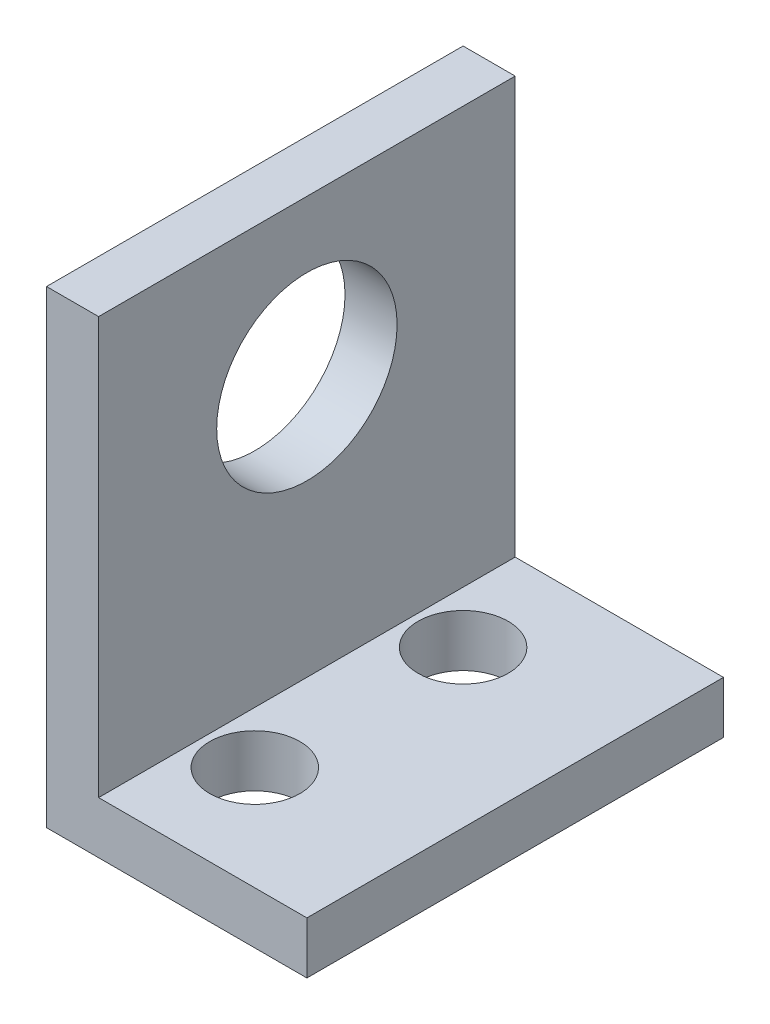
ISO-10303-21;
HEADER;
FILE_DESCRIPTION(('STEP AP214'),'2;1');
FILE_NAME('part.step','',(''),(''),'','','');
FILE_SCHEMA(('AUTOMOTIVE_DESIGN { 1 0 10303 214 1 1 1 1 }'));
ENDSEC;
DATA;
#1=APPLICATION_CONTEXT('core data for automotive mechanical design processes');
#2=APPLICATION_PROTOCOL_DEFINITION('international standard','automotive_design',2000,#1);
#3=PRODUCT_CONTEXT('',#1,'mechanical');
#4=PRODUCT('Part','Part','',(#3));
#5=PRODUCT_RELATED_PRODUCT_CATEGORY('part','',(#4));
#6=PRODUCT_DEFINITION_FORMATION('','',#4);
#7=PRODUCT_DEFINITION_CONTEXT('part definition',#1,'design');
#8=PRODUCT_DEFINITION('design','',#6,#7);
#9=PRODUCT_DEFINITION_SHAPE('','',#8);
#10=(LENGTH_UNIT() NAMED_UNIT(*) SI_UNIT(.MILLI.,.METRE.));
#11=(NAMED_UNIT(*) PLANE_ANGLE_UNIT() SI_UNIT($,.RADIAN.));
#12=(NAMED_UNIT(*) SI_UNIT($,.STERADIAN.) SOLID_ANGLE_UNIT());
#13=UNCERTAINTY_MEASURE_WITH_UNIT(LENGTH_MEASURE(1.E-05),#10,'distance_accuracy_value','');
#14=(GEOMETRIC_REPRESENTATION_CONTEXT(3) GLOBAL_UNCERTAINTY_ASSIGNED_CONTEXT((#13)) GLOBAL_UNIT_ASSIGNED_CONTEXT((#10,
#11,#12)) REPRESENTATION_CONTEXT('',''));
#15=CARTESIAN_POINT('',(0.,0.,0.));
#16=DIRECTION('',(0.,0.,1.));
#17=DIRECTION('',(1.,0.,0.));
#18=AXIS2_PLACEMENT_3D('',#15,#16,#17);
#19=CARTESIAN_POINT('',(0.,28.575,25.4));
#20=DIRECTION('',(1.,0.,0.));
#21=DIRECTION('',(0.,1.,0.));
#22=AXIS2_PLACEMENT_3D('',#19,#20,#21);
#23=PLANE('',#22);
#24=CARTESIAN_POINT('',(0.,19.05,12.7));
#25=DIRECTION('',(1.,0.,0.));
#26=DIRECTION('',(0.,0.,-1.));
#27=AXIS2_PLACEMENT_3D('',#24,#25,#26);
#28=CIRCLE('',#27,5.5);
#29=CARTESIAN_POINT('',(0.,19.05,7.2));
#30=VERTEX_POINT('',#29);
#31=EDGE_CURVE('E124',#30,#30,#28,.T.);
#32=ORIENTED_EDGE('',*,*,#31,.T.);
#33=EDGE_LOOP('',(#32));
#34=FACE_BOUND('',#33,.T.);
#35=DIRECTION('',(0.,-1.,0.));
#36=VECTOR('',#35,1.);
#37=CARTESIAN_POINT('',(0.,28.575,0.));
#38=LINE('',#37,#36);
#39=CARTESIAN_POINT('',(0.,28.575,0.));
#40=VERTEX_POINT('',#39);
#41=CARTESIAN_POINT('',(0.,0.,0.));
#42=VERTEX_POINT('',#41);
#43=EDGE_CURVE('E120',#40,#42,#38,.T.);
#44=ORIENTED_EDGE('',*,*,#43,.T.);
#45=DIRECTION('',(0.,0.,-1.));
#46=VECTOR('',#45,1.);
#47=CARTESIAN_POINT('',(0.,0.,25.4));
#48=LINE('',#47,#46);
#49=CARTESIAN_POINT('',(0.,0.,25.4));
#50=VERTEX_POINT('',#49);
#51=EDGE_CURVE('E11',#50,#42,#48,.T.);
#52=ORIENTED_EDGE('',*,*,#51,.F.);
#53=DIRECTION('',(0.,-1.,0.));
#54=VECTOR('',#53,1.);
#55=CARTESIAN_POINT('',(0.,28.575,25.4));
#56=LINE('',#55,#54);
#57=CARTESIAN_POINT('',(0.,28.575,25.4));
#58=VERTEX_POINT('',#57);
#59=EDGE_CURVE('E131',#58,#50,#56,.T.);
#60=ORIENTED_EDGE('',*,*,#59,.F.);
#61=DIRECTION('',(0.,0.,-1.));
#62=VECTOR('',#61,1.);
#63=CARTESIAN_POINT('',(0.,28.575,25.4));
#64=LINE('',#63,#62);
#65=EDGE_CURVE('E116',#58,#40,#64,.T.);
#66=ORIENTED_EDGE('',*,*,#65,.T.);
#67=EDGE_LOOP('',(#44,#52,#60,#66));
#68=FACE_BOUND('',#67,.T.);
#69=ADVANCED_FACE('F36',(#34,#68),#23,.F.);
#70=CARTESIAN_POINT('',(0.,0.,25.4));
#71=DIRECTION('',(0.,1.,0.));
#72=DIRECTION('',(0.,0.,1.));
#73=AXIS2_PLACEMENT_3D('',#70,#71,#72);
#74=PLANE('',#73);
#75=CARTESIAN_POINT('',(6.34999999999999,0.,19.05));
#76=DIRECTION('',(0.,1.,0.));
#77=DIRECTION('',(0.,0.,1.));
#78=AXIS2_PLACEMENT_3D('',#75,#76,#77);
#79=CIRCLE('',#78,2.75);
#80=CARTESIAN_POINT('',(6.34999999999999,0.,21.8));
#81=VERTEX_POINT('',#80);
#82=EDGE_CURVE('E178',#81,#81,#79,.T.);
#83=ORIENTED_EDGE('',*,*,#82,.T.);
#84=EDGE_LOOP('',(#83));
#85=FACE_BOUND('',#84,.T.);
#86=CARTESIAN_POINT('',(6.34999999999999,0.,6.35));
#87=DIRECTION('',(0.,1.,0.));
#88=DIRECTION('',(0.,0.,1.));
#89=AXIS2_PLACEMENT_3D('',#86,#87,#88);
#90=CIRCLE('',#89,2.75);
#91=CARTESIAN_POINT('',(6.34999999999999,0.,9.1));
#92=VERTEX_POINT('',#91);
#93=EDGE_CURVE('E168',#92,#92,#90,.T.);
#94=ORIENTED_EDGE('',*,*,#93,.T.);
#95=EDGE_LOOP('',(#94));
#96=FACE_BOUND('',#95,.T.);
#97=DIRECTION('',(1.,0.,0.));
#98=VECTOR('',#97,1.);
#99=CARTESIAN_POINT('',(0.,0.,0.));
#100=LINE('',#99,#98);
#101=CARTESIAN_POINT('',(15.875,0.,0.));
#102=VERTEX_POINT('',#101);
#103=EDGE_CURVE('E123',#42,#102,#100,.T.);
#104=ORIENTED_EDGE('',*,*,#103,.T.);
#105=DIRECTION('',(0.,0.,-1.));
#106=VECTOR('',#105,1.);
#107=CARTESIAN_POINT('',(15.875,0.,25.4));
#108=LINE('',#107,#106);
#109=CARTESIAN_POINT('',(15.875,0.,25.4));
#110=VERTEX_POINT('',#109);
#111=EDGE_CURVE('E44',#110,#102,#108,.T.);
#112=ORIENTED_EDGE('',*,*,#111,.F.);
#113=DIRECTION('',(1.,0.,0.));
#114=VECTOR('',#113,1.);
#115=CARTESIAN_POINT('',(0.,0.,25.4));
#116=LINE('',#115,#114);
#117=EDGE_CURVE('E89',#50,#110,#116,.T.);
#118=ORIENTED_EDGE('',*,*,#117,.F.);
#119=ORIENTED_EDGE('',*,*,#51,.T.);
#120=EDGE_LOOP('',(#104,#112,#118,#119));
#121=FACE_BOUND('',#120,.T.);
#122=ADVANCED_FACE('F156',(#85,#96,#121),#74,.F.);
#123=CARTESIAN_POINT('',(15.875,0.,25.4));
#124=DIRECTION('',(-1.,0.,0.));
#125=DIRECTION('',(0.,0.,1.));
#126=AXIS2_PLACEMENT_3D('',#123,#124,#125);
#127=PLANE('',#126);
#128=DIRECTION('',(0.,1.,0.));
#129=VECTOR('',#128,1.);
#130=CARTESIAN_POINT('',(15.875,0.,0.));
#131=LINE('',#130,#129);
#132=CARTESIAN_POINT('',(15.875,3.175,0.));
#133=VERTEX_POINT('',#132);
#134=EDGE_CURVE('E126',#102,#133,#131,.T.);
#135=ORIENTED_EDGE('',*,*,#134,.T.);
#136=DIRECTION('',(0.,0.,-1.));
#137=VECTOR('',#136,1.);
#138=CARTESIAN_POINT('',(15.875,3.175,25.4));
#139=LINE('',#138,#137);
#140=CARTESIAN_POINT('',(15.875,3.175,25.4));
#141=VERTEX_POINT('',#140);
#142=EDGE_CURVE('E111',#141,#133,#139,.T.);
#143=ORIENTED_EDGE('',*,*,#142,.F.);
#144=DIRECTION('',(0.,1.,0.));
#145=VECTOR('',#144,1.);
#146=CARTESIAN_POINT('',(15.875,0.,25.4));
#147=LINE('',#146,#145);
#148=EDGE_CURVE('E102',#110,#141,#147,.T.);
#149=ORIENTED_EDGE('',*,*,#148,.F.);
#150=ORIENTED_EDGE('',*,*,#111,.T.);
#151=EDGE_LOOP('',(#135,#143,#149,#150));
#152=FACE_BOUND('',#151,.T.);
#153=ADVANCED_FACE('F137',(#152),#127,.F.);
#154=CARTESIAN_POINT('',(15.875,3.175,25.4));
#155=DIRECTION('',(0.,-1.,0.));
#156=DIRECTION('',(1.,0.,0.));
#157=AXIS2_PLACEMENT_3D('',#154,#155,#156);
#158=PLANE('',#157);
#159=CARTESIAN_POINT('',(6.34999999999999,3.175,19.05));
#160=DIRECTION('',(0.,1.,0.));
#161=DIRECTION('',(0.,0.,1.));
#162=AXIS2_PLACEMENT_3D('',#159,#160,#161);
#163=CIRCLE('',#162,2.74999999999999);
#164=CARTESIAN_POINT('',(6.34999999999999,3.175,21.8));
#165=VERTEX_POINT('',#164);
#166=EDGE_CURVE('E181',#165,#165,#163,.T.);
#167=ORIENTED_EDGE('',*,*,#166,.F.);
#168=EDGE_LOOP('',(#167));
#169=FACE_BOUND('',#168,.T.);
#170=CARTESIAN_POINT('',(6.34999999999999,3.175,6.35));
#171=DIRECTION('',(0.,1.,0.));
#172=DIRECTION('',(0.,0.,1.));
#173=AXIS2_PLACEMENT_3D('',#170,#171,#172);
#174=CIRCLE('',#173,2.74999999999999);
#175=CARTESIAN_POINT('',(6.34999999999999,3.175,9.09999999999999));
#176=VERTEX_POINT('',#175);
#177=EDGE_CURVE('E175',#176,#176,#174,.T.);
#178=ORIENTED_EDGE('',*,*,#177,.F.);
#179=EDGE_LOOP('',(#178));
#180=FACE_BOUND('',#179,.T.);
#181=DIRECTION('',(-1.,0.,0.));
#182=VECTOR('',#181,1.);
#183=CARTESIAN_POINT('',(15.875,3.175,0.));
#184=LINE('',#183,#182);
#185=CARTESIAN_POINT('',(3.175,3.175,0.));
#186=VERTEX_POINT('',#185);
#187=EDGE_CURVE('E110',#133,#186,#184,.T.);
#188=ORIENTED_EDGE('',*,*,#187,.T.);
#189=DIRECTION('',(0.,0.,-1.));
#190=VECTOR('',#189,1.);
#191=CARTESIAN_POINT('',(3.175,3.175,25.4));
#192=LINE('',#191,#190);
#193=CARTESIAN_POINT('',(3.175,3.175,25.4));
#194=VERTEX_POINT('',#193);
#195=EDGE_CURVE('E107',#194,#186,#192,.T.);
#196=ORIENTED_EDGE('',*,*,#195,.F.);
#197=DIRECTION('',(-1.,0.,0.));
#198=VECTOR('',#197,1.);
#199=CARTESIAN_POINT('',(15.875,3.175,25.4));
#200=LINE('',#199,#198);
#201=EDGE_CURVE('E96',#141,#194,#200,.T.);
#202=ORIENTED_EDGE('',*,*,#201,.F.);
#203=ORIENTED_EDGE('',*,*,#142,.T.);
#204=EDGE_LOOP('',(#188,#196,#202,#203));
#205=FACE_BOUND('',#204,.T.);
#206=ADVANCED_FACE('F108',(#169,#180,#205),#158,.F.);
#207=CARTESIAN_POINT('',(3.175,3.175,25.4));
#208=DIRECTION('',(-1.,0.,0.));
#209=DIRECTION('',(0.,-1.,0.));
#210=AXIS2_PLACEMENT_3D('',#207,#208,#209);
#211=PLANE('',#210);
#212=CARTESIAN_POINT('',(3.17499999999999,19.05,12.7));
#213=DIRECTION('',(1.,0.,0.));
#214=DIRECTION('',(0.,0.,-1.));
#215=AXIS2_PLACEMENT_3D('',#212,#213,#214);
#216=CIRCLE('',#215,5.5);
#217=CARTESIAN_POINT('',(3.17499999999999,19.05,7.2));
#218=VERTEX_POINT('',#217);
#219=EDGE_CURVE('E165',#218,#218,#216,.T.);
#220=ORIENTED_EDGE('',*,*,#219,.F.);
#221=EDGE_LOOP('',(#220));
#222=FACE_BOUND('',#221,.T.);
#223=DIRECTION('',(0.,1.,0.));
#224=VECTOR('',#223,1.);
#225=CARTESIAN_POINT('',(3.175,3.175,0.));
#226=LINE('',#225,#224);
#227=CARTESIAN_POINT('',(3.17499999999999,28.575,0.));
#228=VERTEX_POINT('',#227);
#229=EDGE_CURVE('E75',#186,#228,#226,.T.);
#230=ORIENTED_EDGE('',*,*,#229,.T.);
#231=DIRECTION('',(0.,0.,-1.));
#232=VECTOR('',#231,1.);
#233=CARTESIAN_POINT('',(3.17499999999999,28.575,25.4));
#234=LINE('',#233,#232);
#235=CARTESIAN_POINT('',(3.17499999999999,28.575,25.4));
#236=VERTEX_POINT('',#235);
#237=EDGE_CURVE('E112',#236,#228,#234,.T.);
#238=ORIENTED_EDGE('',*,*,#237,.F.);
#239=DIRECTION('',(0.,1.,0.));
#240=VECTOR('',#239,1.);
#241=CARTESIAN_POINT('',(3.175,3.175,25.4));
#242=LINE('',#241,#240);
#243=EDGE_CURVE('E100',#194,#236,#242,.T.);
#244=ORIENTED_EDGE('',*,*,#243,.F.);
#245=ORIENTED_EDGE('',*,*,#195,.T.);
#246=EDGE_LOOP('',(#230,#238,#244,#245));
#247=FACE_BOUND('',#246,.T.);
#248=ADVANCED_FACE('F114',(#222,#247),#211,.F.);
#249=CARTESIAN_POINT('',(3.17499999999999,28.575,25.4));
#250=DIRECTION('',(0.,-1.,0.));
#251=DIRECTION('',(0.,0.,-1.));
#252=AXIS2_PLACEMENT_3D('',#249,#250,#251);
#253=PLANE('',#252);
#254=DIRECTION('',(-1.,0.,0.));
#255=VECTOR('',#254,1.);
#256=CARTESIAN_POINT('',(3.17499999999999,28.575,0.));
#257=LINE('',#256,#255);
#258=EDGE_CURVE('E81',#228,#40,#257,.T.);
#259=ORIENTED_EDGE('',*,*,#258,.T.);
#260=ORIENTED_EDGE('',*,*,#65,.F.);
#261=DIRECTION('',(-1.,0.,0.));
#262=VECTOR('',#261,1.);
#263=CARTESIAN_POINT('',(3.17499999999999,28.575,25.4));
#264=LINE('',#263,#262);
#265=EDGE_CURVE('E52',#236,#58,#264,.T.);
#266=ORIENTED_EDGE('',*,*,#265,.F.);
#267=ORIENTED_EDGE('',*,*,#237,.T.);
#268=EDGE_LOOP('',(#259,#260,#266,#267));
#269=FACE_BOUND('',#268,.T.);
#270=ADVANCED_FACE('F144',(#269),#253,.F.);
#271=CARTESIAN_POINT('',(0.,0.,25.4));
#272=DIRECTION('',(0.,0.,1.));
#273=DIRECTION('',(1.,0.,0.));
#274=AXIS2_PLACEMENT_3D('',#271,#272,#273);
#275=PLANE('',#274);
#276=ORIENTED_EDGE('',*,*,#59,.T.);
#277=ORIENTED_EDGE('',*,*,#117,.T.);
#278=ORIENTED_EDGE('',*,*,#148,.T.);
#279=ORIENTED_EDGE('',*,*,#201,.T.);
#280=ORIENTED_EDGE('',*,*,#243,.T.);
#281=ORIENTED_EDGE('',*,*,#265,.T.);
#282=EDGE_LOOP('',(#276,#277,#278,#279,#280,#281));
#283=FACE_BOUND('',#282,.T.);
#284=ADVANCED_FACE('F98',(#283),#275,.T.);
#285=CARTESIAN_POINT('',(0.,0.,0.));
#286=DIRECTION('',(0.,0.,1.));
#287=DIRECTION('',(1.,0.,0.));
#288=AXIS2_PLACEMENT_3D('',#285,#286,#287);
#289=PLANE('',#288);
#290=ORIENTED_EDGE('',*,*,#43,.F.);
#291=ORIENTED_EDGE('',*,*,#258,.F.);
#292=ORIENTED_EDGE('',*,*,#229,.F.);
#293=ORIENTED_EDGE('',*,*,#187,.F.);
#294=ORIENTED_EDGE('',*,*,#134,.F.);
#295=ORIENTED_EDGE('',*,*,#103,.F.);
#296=EDGE_LOOP('',(#290,#291,#292,#293,#294,#295));
#297=FACE_BOUND('',#296,.T.);
#298=ADVANCED_FACE('F140',(#297),#289,.F.);
#299=CARTESIAN_POINT('',(3.17499999999999,19.05,12.7));
#300=DIRECTION('',(1.,0.,0.));
#301=DIRECTION('',(0.,0.,-1.));
#302=AXIS2_PLACEMENT_3D('',#299,#300,#301);
#303=CYLINDRICAL_SURFACE('',#302,5.5);
#304=ORIENTED_EDGE('',*,*,#31,.F.);
#305=EDGE_LOOP('',(#304));
#306=FACE_BOUND('',#305,.T.);
#307=ORIENTED_EDGE('',*,*,#219,.T.);
#308=EDGE_LOOP('',(#307));
#309=FACE_BOUND('',#308,.T.);
#310=ADVANCED_FACE('F194',(#306,#309),#303,.F.);
#311=CARTESIAN_POINT('',(6.34999999999999,3.175,6.35));
#312=DIRECTION('',(0.,1.,0.));
#313=DIRECTION('',(0.,0.,1.));
#314=AXIS2_PLACEMENT_3D('',#311,#312,#313);
#315=CYLINDRICAL_SURFACE('',#314,2.74999999999999);
#316=ORIENTED_EDGE('',*,*,#93,.F.);
#317=EDGE_LOOP('',(#316));
#318=FACE_BOUND('',#317,.T.);
#319=ORIENTED_EDGE('',*,*,#177,.T.);
#320=EDGE_LOOP('',(#319));
#321=FACE_BOUND('',#320,.T.);
#322=ADVANCED_FACE('F192',(#318,#321),#315,.F.);
#323=CARTESIAN_POINT('',(6.34999999999999,3.175,19.05));
#324=DIRECTION('',(0.,1.,0.));
#325=DIRECTION('',(0.,0.,1.));
#326=AXIS2_PLACEMENT_3D('',#323,#324,#325);
#327=CYLINDRICAL_SURFACE('',#326,2.74999999999999);
#328=ORIENTED_EDGE('',*,*,#82,.F.);
#329=EDGE_LOOP('',(#328));
#330=FACE_BOUND('',#329,.T.);
#331=ORIENTED_EDGE('',*,*,#166,.T.);
#332=EDGE_LOOP('',(#331));
#333=FACE_BOUND('',#332,.T.);
#334=ADVANCED_FACE('F185',(#330,#333),#327,.F.);
#335=CLOSED_SHELL('',(#69,#122,#153,#206,#248,#270,#284,#298,#310,#322,#334));
#336=MANIFOLD_SOLID_BREP('B2',#335);
#337=ADVANCED_BREP_SHAPE_REPRESENTATION('',(#18,#336),#14);
#338=SHAPE_DEFINITION_REPRESENTATION(#9,#337);
ENDSEC;
END-ISO-10303-21;
